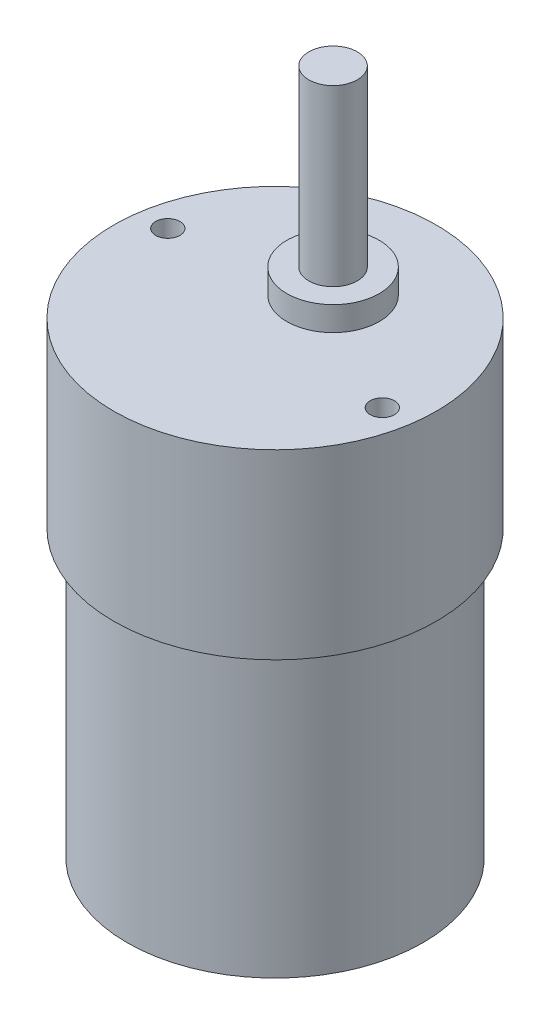
ISO-10303-21;
HEADER;
FILE_DESCRIPTION(('STEP AP214'),'2;1');
FILE_NAME('part.step','',(''),(''),'','','');
FILE_SCHEMA(('AUTOMOTIVE_DESIGN { 1 0 10303 214 1 1 1 1 }'));
ENDSEC;
DATA;
#1=APPLICATION_CONTEXT('core data for automotive mechanical design processes');
#2=APPLICATION_PROTOCOL_DEFINITION('international standard','automotive_design',2000,#1);
#3=PRODUCT_CONTEXT('',#1,'mechanical');
#4=PRODUCT('Part','Part','',(#3));
#5=PRODUCT_RELATED_PRODUCT_CATEGORY('part','',(#4));
#6=PRODUCT_DEFINITION_FORMATION('','',#4);
#7=PRODUCT_DEFINITION_CONTEXT('part definition',#1,'design');
#8=PRODUCT_DEFINITION('design','',#6,#7);
#9=PRODUCT_DEFINITION_SHAPE('','',#8);
#10=(LENGTH_UNIT() NAMED_UNIT(*) SI_UNIT(.MILLI.,.METRE.));
#11=(NAMED_UNIT(*) PLANE_ANGLE_UNIT() SI_UNIT($,.RADIAN.));
#12=(NAMED_UNIT(*) SI_UNIT($,.STERADIAN.) SOLID_ANGLE_UNIT());
#13=UNCERTAINTY_MEASURE_WITH_UNIT(LENGTH_MEASURE(1.E-05),#10,'distance_accuracy_value','');
#14=(GEOMETRIC_REPRESENTATION_CONTEXT(3) GLOBAL_UNCERTAINTY_ASSIGNED_CONTEXT((#13)) GLOBAL_UNIT_ASSIGNED_CONTEXT((#10,
#11,#12)) REPRESENTATION_CONTEXT('',''));
#15=CARTESIAN_POINT('',(0.,0.,0.));
#16=DIRECTION('',(0.,0.,1.));
#17=DIRECTION('',(1.,0.,0.));
#18=AXIS2_PLACEMENT_3D('',#15,#16,#17);
#19=CARTESIAN_POINT('',(0.,15.,0.));
#20=DIRECTION('',(0.,1.,0.));
#21=DIRECTION('',(0.,0.,1.));
#22=AXIS2_PLACEMENT_3D('',#19,#20,#21);
#23=PLANE('',#22);
#24=CARTESIAN_POINT('',(-10.8207672463942,15.,-1.97762387712188));
#25=DIRECTION('',(0.,1.,0.));
#26=DIRECTION('',(0.,0.,1.));
#27=AXIS2_PLACEMENT_3D('',#24,#25,#26);
#28=CIRCLE('',#27,1.);
#29=CARTESIAN_POINT('',(-10.8207672463942,15.,-0.977623877121883));
#30=VERTEX_POINT('',#29);
#31=EDGE_CURVE('E54',#30,#30,#28,.T.);
#32=ORIENTED_EDGE('',*,*,#31,.F.);
#33=EDGE_LOOP('',(#32));
#34=FACE_BOUND('',#33,.T.);
#35=CARTESIAN_POINT('',(10.8207672463942,15.,1.97762387712188));
#36=DIRECTION('',(0.,1.,0.));
#37=DIRECTION('',(0.,0.,1.));
#38=AXIS2_PLACEMENT_3D('',#35,#36,#37);
#39=CIRCLE('',#38,1.);
#40=CARTESIAN_POINT('',(10.8207672463942,15.,2.97762387712188));
#41=VERTEX_POINT('',#40);
#42=EDGE_CURVE('E60',#41,#41,#39,.T.);
#43=ORIENTED_EDGE('',*,*,#42,.F.);
#44=EDGE_LOOP('',(#43));
#45=FACE_BOUND('',#44,.T.);
#46=CARTESIAN_POINT('',(0.,15.,0.));
#47=DIRECTION('',(0.,1.,0.));
#48=DIRECTION('',(0.,0.,1.));
#49=AXIS2_PLACEMENT_3D('',#46,#47,#48);
#50=CIRCLE('',#49,13.3);
#51=CARTESIAN_POINT('',(0.,15.,13.3));
#52=VERTEX_POINT('',#51);
#53=EDGE_CURVE('E67',#52,#52,#50,.T.);
#54=ORIENTED_EDGE('',*,*,#53,.T.);
#55=EDGE_LOOP('',(#54));
#56=FACE_BOUND('',#55,.T.);
#57=CARTESIAN_POINT('',(0.738912194088267,15.,-4.0430321256982));
#58=DIRECTION('',(0.,1.,0.));
#59=DIRECTION('',(0.,0.,1.));
#60=AXIS2_PLACEMENT_3D('',#57,#58,#59);
#61=CIRCLE('',#60,3.81);
#62=CARTESIAN_POINT('',(0.738912194088267,15.,-0.233032125698196));
#63=VERTEX_POINT('',#62);
#64=EDGE_CURVE('E43',#63,#63,#61,.T.);
#65=ORIENTED_EDGE('',*,*,#64,.F.);
#66=EDGE_LOOP('',(#65));
#67=FACE_BOUND('',#66,.T.);
#68=ADVANCED_FACE('F39',(#34,#45,#56,#67),#23,.T.);
#69=CARTESIAN_POINT('',(0.,0.,0.));
#70=DIRECTION('',(0.,1.,0.));
#71=DIRECTION('',(0.,0.,1.));
#72=AXIS2_PLACEMENT_3D('',#69,#70,#71);
#73=PLANE('',#72);
#74=CARTESIAN_POINT('',(0.,0.,0.));
#75=DIRECTION('',(0.,1.,0.));
#76=DIRECTION('',(0.,0.,1.));
#77=AXIS2_PLACEMENT_3D('',#74,#75,#76);
#78=CIRCLE('',#77,13.3);
#79=CARTESIAN_POINT('',(0.,0.,13.3));
#80=VERTEX_POINT('',#79);
#81=EDGE_CURVE('E70',#80,#80,#78,.T.);
#82=ORIENTED_EDGE('',*,*,#81,.F.);
#83=EDGE_LOOP('',(#82));
#84=FACE_BOUND('',#83,.T.);
#85=CARTESIAN_POINT('',(0.,0.,0.));
#86=DIRECTION('',(0.,1.,0.));
#87=DIRECTION('',(0.,0.,1.));
#88=AXIS2_PLACEMENT_3D('',#85,#86,#87);
#89=CIRCLE('',#88,12.2);
#90=CARTESIAN_POINT('',(0.,0.,12.2));
#91=VERTEX_POINT('',#90);
#92=EDGE_CURVE('E66',#91,#91,#89,.F.);
#93=ORIENTED_EDGE('',*,*,#92,.F.);
#94=EDGE_LOOP('',(#93));
#95=FACE_BOUND('',#94,.T.);
#96=ADVANCED_FACE('F78',(#84,#95),#73,.F.);
#97=CARTESIAN_POINT('',(0.,15.,0.));
#98=DIRECTION('',(0.,-1.,0.));
#99=DIRECTION('',(0.,0.,-1.));
#100=AXIS2_PLACEMENT_3D('',#97,#98,#99);
#101=CYLINDRICAL_SURFACE('',#100,13.3);
#102=ORIENTED_EDGE('',*,*,#53,.F.);
#103=EDGE_LOOP('',(#102));
#104=FACE_BOUND('',#103,.T.);
#105=ORIENTED_EDGE('',*,*,#81,.T.);
#106=EDGE_LOOP('',(#105));
#107=FACE_BOUND('',#106,.T.);
#108=ADVANCED_FACE('F80',(#104,#107),#101,.T.);
#109=CARTESIAN_POINT('',(0.,-23.5,0.));
#110=DIRECTION('',(0.,1.,0.));
#111=DIRECTION('',(0.,0.,1.));
#112=AXIS2_PLACEMENT_3D('',#109,#110,#111);
#113=CYLINDRICAL_SURFACE('',#112,12.2);
#114=CARTESIAN_POINT('',(0.,-23.5,0.));
#115=DIRECTION('',(0.,-1.,0.));
#116=DIRECTION('',(0.,0.,-1.));
#117=AXIS2_PLACEMENT_3D('',#114,#115,#116);
#118=CIRCLE('',#117,12.2);
#119=CARTESIAN_POINT('',(0.,-23.5,-12.2));
#120=VERTEX_POINT('',#119);
#121=EDGE_CURVE('E63',#120,#120,#118,.T.);
#122=ORIENTED_EDGE('',*,*,#121,.F.);
#123=EDGE_LOOP('',(#122));
#124=FACE_BOUND('',#123,.T.);
#125=ORIENTED_EDGE('',*,*,#92,.T.);
#126=EDGE_LOOP('',(#125));
#127=FACE_BOUND('',#126,.T.);
#128=ADVANCED_FACE('F76',(#124,#127),#113,.T.);
#129=CARTESIAN_POINT('',(0.,-23.5,0.));
#130=DIRECTION('',(0.,-1.,0.));
#131=DIRECTION('',(0.,0.,-1.));
#132=AXIS2_PLACEMENT_3D('',#129,#130,#131);
#133=PLANE('',#132);
#134=ORIENTED_EDGE('',*,*,#121,.T.);
#135=EDGE_LOOP('',(#134));
#136=FACE_BOUND('',#135,.T.);
#137=ADVANCED_FACE('F95',(#136),#133,.T.);
#138=CARTESIAN_POINT('',(10.8207672463942,11.,1.97762387712188));
#139=DIRECTION('',(0.,1.,0.));
#140=DIRECTION('',(0.,0.,1.));
#141=AXIS2_PLACEMENT_3D('',#138,#139,#140);
#142=CYLINDRICAL_SURFACE('',#141,1.);
#143=CARTESIAN_POINT('',(10.8207672463942,11.,1.97762387712188));
#144=DIRECTION('',(0.,1.,0.));
#145=DIRECTION('',(0.,0.,1.));
#146=AXIS2_PLACEMENT_3D('',#143,#144,#145);
#147=CIRCLE('',#146,1.);
#148=CARTESIAN_POINT('',(10.8207672463942,11.,2.97762387712188));
#149=VERTEX_POINT('',#148);
#150=EDGE_CURVE('E57',#149,#149,#147,.T.);
#151=ORIENTED_EDGE('',*,*,#150,.F.);
#152=EDGE_LOOP('',(#151));
#153=FACE_BOUND('',#152,.T.);
#154=ORIENTED_EDGE('',*,*,#42,.T.);
#155=EDGE_LOOP('',(#154));
#156=FACE_BOUND('',#155,.T.);
#157=ADVANCED_FACE('F99',(#153,#156),#142,.F.);
#158=CARTESIAN_POINT('',(10.8207672463942,11.,1.97762387712188));
#159=DIRECTION('',(0.,1.,0.));
#160=DIRECTION('',(0.,0.,1.));
#161=AXIS2_PLACEMENT_3D('',#158,#159,#160);
#162=PLANE('',#161);
#163=ORIENTED_EDGE('',*,*,#150,.T.);
#164=EDGE_LOOP('',(#163));
#165=FACE_BOUND('',#164,.T.);
#166=ADVANCED_FACE('F103',(#165),#162,.T.);
#167=CARTESIAN_POINT('',(-10.8207672463942,11.,-1.97762387712188));
#168=DIRECTION('',(0.,1.,0.));
#169=DIRECTION('',(0.,0.,1.));
#170=AXIS2_PLACEMENT_3D('',#167,#168,#169);
#171=CYLINDRICAL_SURFACE('',#170,1.);
#172=CARTESIAN_POINT('',(-10.8207672463942,11.,-1.97762387712188));
#173=DIRECTION('',(0.,1.,0.));
#174=DIRECTION('',(0.,0.,1.));
#175=AXIS2_PLACEMENT_3D('',#172,#173,#174);
#176=CIRCLE('',#175,1.);
#177=CARTESIAN_POINT('',(-10.8207672463942,11.,-0.977623877121883));
#178=VERTEX_POINT('',#177);
#179=EDGE_CURVE('E50',#178,#178,#176,.T.);
#180=ORIENTED_EDGE('',*,*,#179,.F.);
#181=EDGE_LOOP('',(#180));
#182=FACE_BOUND('',#181,.T.);
#183=ORIENTED_EDGE('',*,*,#31,.T.);
#184=EDGE_LOOP('',(#183));
#185=FACE_BOUND('',#184,.T.);
#186=ADVANCED_FACE('F107',(#182,#185),#171,.F.);
#187=CARTESIAN_POINT('',(-10.8207672463942,11.,-1.97762387712188));
#188=DIRECTION('',(0.,1.,0.));
#189=DIRECTION('',(0.,0.,1.));
#190=AXIS2_PLACEMENT_3D('',#187,#188,#189);
#191=PLANE('',#190);
#192=ORIENTED_EDGE('',*,*,#179,.T.);
#193=EDGE_LOOP('',(#192));
#194=FACE_BOUND('',#193,.T.);
#195=ADVANCED_FACE('F111',(#194),#191,.T.);
#196=CARTESIAN_POINT('',(0.738912194088267,11.,-4.0430321256982));
#197=DIRECTION('',(0.,1.,0.));
#198=DIRECTION('',(0.,0.,1.));
#199=AXIS2_PLACEMENT_3D('',#196,#197,#198);
#200=CYLINDRICAL_SURFACE('',#199,3.81);
#201=CARTESIAN_POINT('',(0.738912194088267,11.,-4.0430321256982));
#202=DIRECTION('',(0.,1.,0.));
#203=DIRECTION('',(0.,0.,1.));
#204=AXIS2_PLACEMENT_3D('',#201,#202,#203);
#205=CIRCLE('',#204,3.81);
#206=CARTESIAN_POINT('',(0.738912194088267,11.,-0.233032125698196));
#207=VERTEX_POINT('',#206);
#208=EDGE_CURVE('E11',#207,#207,#205,.T.);
#209=ORIENTED_EDGE('',*,*,#208,.F.);
#210=EDGE_LOOP('',(#209));
#211=FACE_BOUND('',#210,.T.);
#212=ORIENTED_EDGE('',*,*,#64,.T.);
#213=EDGE_LOOP('',(#212));
#214=FACE_BOUND('',#213,.T.);
#215=ADVANCED_FACE('F114',(#211,#214),#200,.F.);
#216=CARTESIAN_POINT('',(0.738912194088267,11.,-4.0430321256982));
#217=DIRECTION('',(0.,1.,0.));
#218=DIRECTION('',(0.,0.,1.));
#219=AXIS2_PLACEMENT_3D('',#216,#217,#218);
#220=PLANE('',#219);
#221=ORIENTED_EDGE('',*,*,#208,.T.);
#222=EDGE_LOOP('',(#221));
#223=FACE_BOUND('',#222,.T.);
#224=ADVANCED_FACE('F41',(#223),#220,.T.);
#225=CLOSED_SHELL('',(#68,#96,#108,#128,#137,#157,#166,#186,#195,#215,#224));
#226=MANIFOLD_SOLID_BREP('B2',#225);
#227=CARTESIAN_POINT('',(0.738912194088267,17.,-4.0430321256982));
#228=DIRECTION('',(0.,1.,0.));
#229=DIRECTION('',(0.,0.,1.));
#230=AXIS2_PLACEMENT_3D('',#227,#228,#229);
#231=PLANE('',#230);
#232=CARTESIAN_POINT('',(0.738912194088267,17.,-4.0430321256982));
#233=DIRECTION('',(0.,1.,0.));
#234=DIRECTION('',(0.,0.,1.));
#235=AXIS2_PLACEMENT_3D('',#232,#233,#234);
#236=CIRCLE('',#235,3.81);
#237=CARTESIAN_POINT('',(0.738912194088267,17.,-0.233032125698196));
#238=VERTEX_POINT('',#237);
#239=EDGE_CURVE('E38',#238,#238,#236,.T.);
#240=ORIENTED_EDGE('',*,*,#239,.T.);
#241=EDGE_LOOP('',(#240));
#242=FACE_BOUND('',#241,.T.);
#243=CARTESIAN_POINT('',(0.738912194088267,17.,-4.0430321256982));
#244=DIRECTION('',(0.,1.,0.));
#245=DIRECTION('',(0.,0.,1.));
#246=AXIS2_PLACEMENT_3D('',#243,#244,#245);
#247=CIRCLE('',#246,2.);
#248=CARTESIAN_POINT('',(0.738912194088267,17.,-2.0430321256982));
#249=VERTEX_POINT('',#248);
#250=EDGE_CURVE('E215',#249,#249,#247,.T.);
#251=ORIENTED_EDGE('',*,*,#250,.F.);
#252=EDGE_LOOP('',(#251));
#253=FACE_BOUND('',#252,.T.);
#254=ADVANCED_FACE('F200',(#242,#253),#231,.T.);
#255=CARTESIAN_POINT('',(0.738912194088267,17.,-4.0430321256982));
#256=DIRECTION('',(0.,-1.,0.));
#257=DIRECTION('',(0.,0.,-1.));
#258=AXIS2_PLACEMENT_3D('',#255,#256,#257);
#259=CYLINDRICAL_SURFACE('',#258,3.81);
#260=ORIENTED_EDGE('',*,*,#239,.F.);
#261=EDGE_LOOP('',(#260));
#262=FACE_BOUND('',#261,.T.);
#263=CARTESIAN_POINT('',(0.738912194088267,15.,-4.0430321256982));
#264=DIRECTION('',(0.,1.,0.));
#265=DIRECTION('',(0.,0.,1.));
#266=AXIS2_PLACEMENT_3D('',#263,#264,#265);
#267=CIRCLE('',#266,3.81);
#268=CARTESIAN_POINT('',(0.738912194088267,15.,-0.233032125698196));
#269=VERTEX_POINT('',#268);
#270=EDGE_CURVE('E207',#269,#269,#267,.T.);
#271=ORIENTED_EDGE('',*,*,#270,.T.);
#272=EDGE_LOOP('',(#271));
#273=FACE_BOUND('',#272,.T.);
#274=ADVANCED_FACE('F202',(#262,#273),#259,.T.);
#275=CARTESIAN_POINT('',(0.738912194088267,15.,-4.0430321256982));
#276=DIRECTION('',(0.,1.,0.));
#277=DIRECTION('',(0.,0.,1.));
#278=AXIS2_PLACEMENT_3D('',#275,#276,#277);
#279=PLANE('',#278);
#280=ORIENTED_EDGE('',*,*,#270,.F.);
#281=EDGE_LOOP('',(#280));
#282=FACE_BOUND('',#281,.T.);
#283=ADVANCED_FACE('F227',(#282),#279,.F.);
#284=CARTESIAN_POINT('',(0.738912194088267,31.36,-4.0430321256982));
#285=DIRECTION('',(0.,-1.,0.));
#286=DIRECTION('',(0.,0.,-1.));
#287=AXIS2_PLACEMENT_3D('',#284,#285,#286);
#288=CYLINDRICAL_SURFACE('',#287,2.);
#289=CARTESIAN_POINT('',(0.738912194088267,31.36,-4.0430321256982));
#290=DIRECTION('',(0.,1.,0.));
#291=DIRECTION('',(0.,0.,1.));
#292=AXIS2_PLACEMENT_3D('',#289,#290,#291);
#293=CIRCLE('',#292,2.);
#294=CARTESIAN_POINT('',(0.738912194088267,31.36,-2.0430321256982));
#295=VERTEX_POINT('',#294);
#296=EDGE_CURVE('E211',#295,#295,#293,.T.);
#297=ORIENTED_EDGE('',*,*,#296,.F.);
#298=EDGE_LOOP('',(#297));
#299=FACE_BOUND('',#298,.T.);
#300=ORIENTED_EDGE('',*,*,#250,.T.);
#301=EDGE_LOOP('',(#300));
#302=FACE_BOUND('',#301,.T.);
#303=ADVANCED_FACE('F221',(#299,#302),#288,.T.);
#304=CARTESIAN_POINT('',(0.738912194088267,31.36,-4.0430321256982));
#305=DIRECTION('',(0.,1.,0.));
#306=DIRECTION('',(0.,0.,1.));
#307=AXIS2_PLACEMENT_3D('',#304,#305,#306);
#308=PLANE('',#307);
#309=ORIENTED_EDGE('',*,*,#296,.T.);
#310=EDGE_LOOP('',(#309));
#311=FACE_BOUND('',#310,.T.);
#312=ADVANCED_FACE('F235',(#311),#308,.T.);
#313=CLOSED_SHELL('',(#254,#274,#283,#303,#312));
#314=MANIFOLD_SOLID_BREP('B6',#313);
#315=ADVANCED_BREP_SHAPE_REPRESENTATION('',(#18,#226,#314),#14);
#316=SHAPE_DEFINITION_REPRESENTATION(#9,#315);
ENDSEC;
END-ISO-10303-21;
